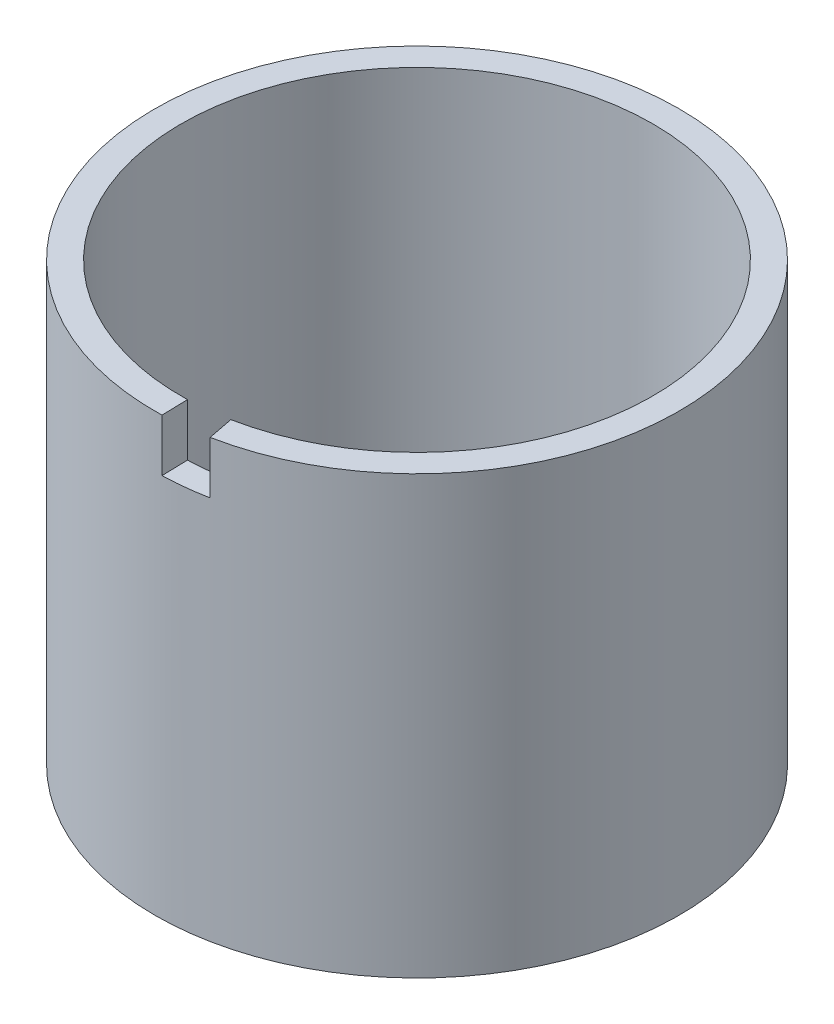
ISO-10303-21;
HEADER;
FILE_DESCRIPTION(('STEP AP214'),'2;1');
FILE_NAME('part.step','',(''),(''),'','','');
FILE_SCHEMA(('AUTOMOTIVE_DESIGN { 1 0 10303 214 1 1 1 1 }'));
ENDSEC;
DATA;
#1=APPLICATION_CONTEXT('core data for automotive mechanical design processes');
#2=APPLICATION_PROTOCOL_DEFINITION('international standard','automotive_design',2000,#1);
#3=PRODUCT_CONTEXT('',#1,'mechanical');
#4=PRODUCT('Part','Part','',(#3));
#5=PRODUCT_RELATED_PRODUCT_CATEGORY('part','',(#4));
#6=PRODUCT_DEFINITION_FORMATION('','',#4);
#7=PRODUCT_DEFINITION_CONTEXT('part definition',#1,'design');
#8=PRODUCT_DEFINITION('design','',#6,#7);
#9=PRODUCT_DEFINITION_SHAPE('','',#8);
#10=(LENGTH_UNIT() NAMED_UNIT(*) SI_UNIT(.MILLI.,.METRE.));
#11=(NAMED_UNIT(*) PLANE_ANGLE_UNIT() SI_UNIT($,.RADIAN.));
#12=(NAMED_UNIT(*) SI_UNIT($,.STERADIAN.) SOLID_ANGLE_UNIT());
#13=UNCERTAINTY_MEASURE_WITH_UNIT(LENGTH_MEASURE(1.E-05),#10,'distance_accuracy_value','');
#14=(GEOMETRIC_REPRESENTATION_CONTEXT(3) GLOBAL_UNCERTAINTY_ASSIGNED_CONTEXT((#13)) GLOBAL_UNIT_ASSIGNED_CONTEXT((#10,
#11,#12)) REPRESENTATION_CONTEXT('',''));
#15=CARTESIAN_POINT('',(0.,0.,0.));
#16=DIRECTION('',(0.,0.,1.));
#17=DIRECTION('',(1.,0.,0.));
#18=AXIS2_PLACEMENT_3D('',#15,#16,#17);
#19=CARTESIAN_POINT('',(0.,25.,0.));
#20=DIRECTION('',(0.,-1.,0.));
#21=DIRECTION('',(0.,0.,-1.));
#22=AXIS2_PLACEMENT_3D('',#19,#20,#21);
#23=CYLINDRICAL_SURFACE('',#22,15.);
#24=CARTESIAN_POINT('',(0.,25.,0.));
#25=DIRECTION('',(0.,1.,0.));
#26=DIRECTION('',(0.,0.,1.));
#27=AXIS2_PLACEMENT_3D('',#24,#25,#26);
#28=CIRCLE('',#27,15.);
#29=CARTESIAN_POINT('',(2.87874385054779,25.,14.7211695813523));
#30=VERTEX_POINT('',#29);
#31=CARTESIAN_POINT('',(0.395770295819883,25.,14.9947779534392));
#32=VERTEX_POINT('',#31);
#33=EDGE_CURVE('E13',#30,#32,#28,.T.);
#34=ORIENTED_EDGE('',*,*,#33,.F.);
#35=DIRECTION('',(0.,1.,0.));
#36=VECTOR('',#35,1.);
#37=CARTESIAN_POINT('',(2.87874385054779,22.,14.7211695813523));
#38=LINE('',#37,#36);
#39=CARTESIAN_POINT('',(2.87874385054779,22.,14.7211695813523));
#40=VERTEX_POINT('',#39);
#41=EDGE_CURVE('E123',#40,#30,#38,.T.);
#42=ORIENTED_EDGE('',*,*,#41,.F.);
#43=CARTESIAN_POINT('',(0.,22.,0.));
#44=DIRECTION('',(0.,1.,0.));
#45=DIRECTION('',(0.,0.,1.));
#46=AXIS2_PLACEMENT_3D('',#43,#44,#45);
#47=CIRCLE('',#46,15.);
#48=CARTESIAN_POINT('',(0.395770295819883,22.,14.9947779534392));
#49=VERTEX_POINT('',#48);
#50=EDGE_CURVE('E77',#49,#40,#47,.T.);
#51=ORIENTED_EDGE('',*,*,#50,.F.);
#52=DIRECTION('',(0.,1.,0.));
#53=VECTOR('',#52,1.);
#54=CARTESIAN_POINT('',(0.395770295819883,22.,14.9947779534392));
#55=LINE('',#54,#53);
#56=EDGE_CURVE('E105',#49,#32,#55,.T.);
#57=ORIENTED_EDGE('',*,*,#56,.T.);
#58=EDGE_LOOP('',(#34,#42,#51,#57));
#59=FACE_BOUND('',#58,.T.);
#60=CARTESIAN_POINT('',(0.,0.,0.));
#61=DIRECTION('',(0.,1.,0.));
#62=DIRECTION('',(0.,0.,1.));
#63=AXIS2_PLACEMENT_3D('',#60,#61,#62);
#64=CIRCLE('',#63,15.);
#65=CARTESIAN_POINT('',(0.,0.,15.));
#66=VERTEX_POINT('',#65);
#67=EDGE_CURVE('E59',#66,#66,#64,.T.);
#68=ORIENTED_EDGE('',*,*,#67,.T.);
#69=EDGE_LOOP('',(#68));
#70=FACE_BOUND('',#69,.T.);
#71=ADVANCED_FACE('F56',(#59,#70),#23,.T.);
#72=CARTESIAN_POINT('',(0.,25.,0.));
#73=DIRECTION('',(0.,1.,0.));
#74=DIRECTION('',(0.,0.,1.));
#75=AXIS2_PLACEMENT_3D('',#72,#73,#74);
#76=PLANE('',#75);
#77=DIRECTION('',(-0.191916256703186,0.,-0.981411305423489));
#78=VECTOR('',#77,1.);
#79=CARTESIAN_POINT('',(2.59086946549301,25.,13.2490526232171));
#80=LINE('',#79,#78);
#81=CARTESIAN_POINT('',(2.59086946549301,25.,13.2490526232171));
#82=VERTEX_POINT('',#81);
#83=EDGE_CURVE('E95',#30,#82,#80,.T.);
#84=ORIENTED_EDGE('',*,*,#83,.F.);
#85=ORIENTED_EDGE('',*,*,#33,.T.);
#86=DIRECTION('',(0.0263846863879922,0.,0.999651863562614));
#87=VECTOR('',#86,1.);
#88=CARTESIAN_POINT('',(0.356193266237895,25.,13.4953001580953));
#89=LINE('',#88,#87);
#90=CARTESIAN_POINT('',(0.356193266237895,25.,13.4953001580953));
#91=VERTEX_POINT('',#90);
#92=EDGE_CURVE('E158',#91,#32,#89,.T.);
#93=ORIENTED_EDGE('',*,*,#92,.F.);
#94=CARTESIAN_POINT('',(0.,25.,0.));
#95=DIRECTION('',(0.,1.,0.));
#96=DIRECTION('',(0.,0.,1.));
#97=AXIS2_PLACEMENT_3D('',#94,#95,#96);
#98=CIRCLE('',#97,13.5);
#99=EDGE_CURVE('E118',#82,#91,#98,.T.);
#100=ORIENTED_EDGE('',*,*,#99,.F.);
#101=EDGE_LOOP('',(#84,#85,#93,#100));
#102=FACE_BOUND('',#101,.T.);
#103=ADVANCED_FACE('F141',(#102),#76,.T.);
#104=CARTESIAN_POINT('',(0.,0.,0.));
#105=DIRECTION('',(0.,1.,0.));
#106=DIRECTION('',(0.,0.,1.));
#107=AXIS2_PLACEMENT_3D('',#104,#105,#106);
#108=PLANE('',#107);
#109=ORIENTED_EDGE('',*,*,#67,.F.);
#110=EDGE_LOOP('',(#109));
#111=FACE_BOUND('',#110,.T.);
#112=ADVANCED_FACE('F139',(#111),#108,.F.);
#113=CARTESIAN_POINT('',(0.,25.,0.));
#114=DIRECTION('',(0.,-1.,0.));
#115=DIRECTION('',(0.,0.,-1.));
#116=AXIS2_PLACEMENT_3D('',#113,#114,#115);
#117=CYLINDRICAL_SURFACE('',#116,13.5);
#118=DIRECTION('',(0.,1.,0.));
#119=VECTOR('',#118,1.);
#120=CARTESIAN_POINT('',(2.59086946549301,22.,13.2490526232171));
#121=LINE('',#120,#119);
#122=CARTESIAN_POINT('',(2.59086946549301,22.,13.2490526232171));
#123=VERTEX_POINT('',#122);
#124=EDGE_CURVE('E132',#123,#82,#121,.T.);
#125=ORIENTED_EDGE('',*,*,#124,.T.);
#126=ORIENTED_EDGE('',*,*,#99,.T.);
#127=DIRECTION('',(0.,1.,0.));
#128=VECTOR('',#127,1.);
#129=CARTESIAN_POINT('',(0.356193266237895,22.,13.4953001580953));
#130=LINE('',#129,#128);
#131=CARTESIAN_POINT('',(0.356193266237895,22.,13.4953001580953));
#132=VERTEX_POINT('',#131);
#133=EDGE_CURVE('E102',#132,#91,#130,.T.);
#134=ORIENTED_EDGE('',*,*,#133,.F.);
#135=CARTESIAN_POINT('',(0.,22.,0.));
#136=DIRECTION('',(0.,-1.,0.));
#137=DIRECTION('',(0.,0.,1.));
#138=AXIS2_PLACEMENT_3D('',#135,#136,#137);
#139=CIRCLE('',#138,13.5);
#140=EDGE_CURVE('E107',#123,#132,#139,.T.);
#141=ORIENTED_EDGE('',*,*,#140,.F.);
#142=EDGE_LOOP('',(#125,#126,#134,#141));
#143=FACE_BOUND('',#142,.T.);
#144=CARTESIAN_POINT('',(0.,1.5,0.));
#145=DIRECTION('',(0.,1.,0.));
#146=DIRECTION('',(0.,0.,1.));
#147=AXIS2_PLACEMENT_3D('',#144,#145,#146);
#148=CIRCLE('',#147,13.5);
#149=CARTESIAN_POINT('',(0.,1.5,13.5));
#150=VERTEX_POINT('',#149);
#151=EDGE_CURVE('E128',#150,#150,#148,.T.);
#152=ORIENTED_EDGE('',*,*,#151,.F.);
#153=EDGE_LOOP('',(#152));
#154=FACE_BOUND('',#153,.T.);
#155=ADVANCED_FACE('F115',(#143,#154),#117,.F.);
#156=CARTESIAN_POINT('',(0.,1.5,0.));
#157=DIRECTION('',(0.,1.,0.));
#158=DIRECTION('',(0.,0.,1.));
#159=AXIS2_PLACEMENT_3D('',#156,#157,#158);
#160=PLANE('',#159);
#161=ORIENTED_EDGE('',*,*,#151,.T.);
#162=EDGE_LOOP('',(#161));
#163=FACE_BOUND('',#162,.T.);
#164=ADVANCED_FACE('F147',(#163),#160,.T.);
#165=CARTESIAN_POINT('',(2.59086946549301,22.,13.2490526232171));
#166=DIRECTION('',(0.981411305423489,0.,-0.191916256703186));
#167=DIRECTION('',(-0.191916256703186,0.,-0.981411305423489));
#168=AXIS2_PLACEMENT_3D('',#165,#166,#167);
#169=PLANE('',#168);
#170=ORIENTED_EDGE('',*,*,#83,.T.);
#171=ORIENTED_EDGE('',*,*,#124,.F.);
#172=DIRECTION('',(-0.191916256703186,0.,-0.981411305423489));
#173=VECTOR('',#172,1.);
#174=CARTESIAN_POINT('',(2.59086946549301,22.,13.2490526232171));
#175=LINE('',#174,#173);
#176=EDGE_CURVE('E71',#40,#123,#175,.T.);
#177=ORIENTED_EDGE('',*,*,#176,.F.);
#178=ORIENTED_EDGE('',*,*,#41,.T.);
#179=EDGE_LOOP('',(#170,#171,#177,#178));
#180=FACE_BOUND('',#179,.T.);
#181=ADVANCED_FACE('F166',(#180),#169,.F.);
#182=CARTESIAN_POINT('',(0.356193266237895,22.,13.4953001580953));
#183=DIRECTION('',(-0.999651863562614,0.,0.0263846863879922));
#184=DIRECTION('',(0.0263846863879922,0.,0.999651863562614));
#185=AXIS2_PLACEMENT_3D('',#182,#183,#184);
#186=PLANE('',#185);
#187=ORIENTED_EDGE('',*,*,#92,.T.);
#188=ORIENTED_EDGE('',*,*,#56,.F.);
#189=DIRECTION('',(0.0263846863879922,0.,0.999651863562614));
#190=VECTOR('',#189,1.);
#191=CARTESIAN_POINT('',(0.356193266237895,22.,13.4953001580953));
#192=LINE('',#191,#190);
#193=EDGE_CURVE('E99',#132,#49,#192,.T.);
#194=ORIENTED_EDGE('',*,*,#193,.F.);
#195=ORIENTED_EDGE('',*,*,#133,.T.);
#196=EDGE_LOOP('',(#187,#188,#194,#195));
#197=FACE_BOUND('',#196,.T.);
#198=ADVANCED_FACE('F100',(#197),#186,.F.);
#199=CARTESIAN_POINT('',(0.,22.,0.));
#200=DIRECTION('',(0.,1.,0.));
#201=DIRECTION('',(0.,0.,1.));
#202=AXIS2_PLACEMENT_3D('',#199,#200,#201);
#203=PLANE('',#202);
#204=ORIENTED_EDGE('',*,*,#140,.T.);
#205=ORIENTED_EDGE('',*,*,#193,.T.);
#206=ORIENTED_EDGE('',*,*,#50,.T.);
#207=ORIENTED_EDGE('',*,*,#176,.T.);
#208=EDGE_LOOP('',(#204,#205,#206,#207));
#209=FACE_BOUND('',#208,.T.);
#210=ADVANCED_FACE('F110',(#209),#203,.T.);
#211=CLOSED_SHELL('',(#71,#103,#112,#155,#164,#181,#198,#210));
#212=MANIFOLD_SOLID_BREP('B2',#211);
#213=ADVANCED_BREP_SHAPE_REPRESENTATION('',(#18,#212),#14);
#214=SHAPE_DEFINITION_REPRESENTATION(#9,#213);
ENDSEC;
END-ISO-10303-21;
